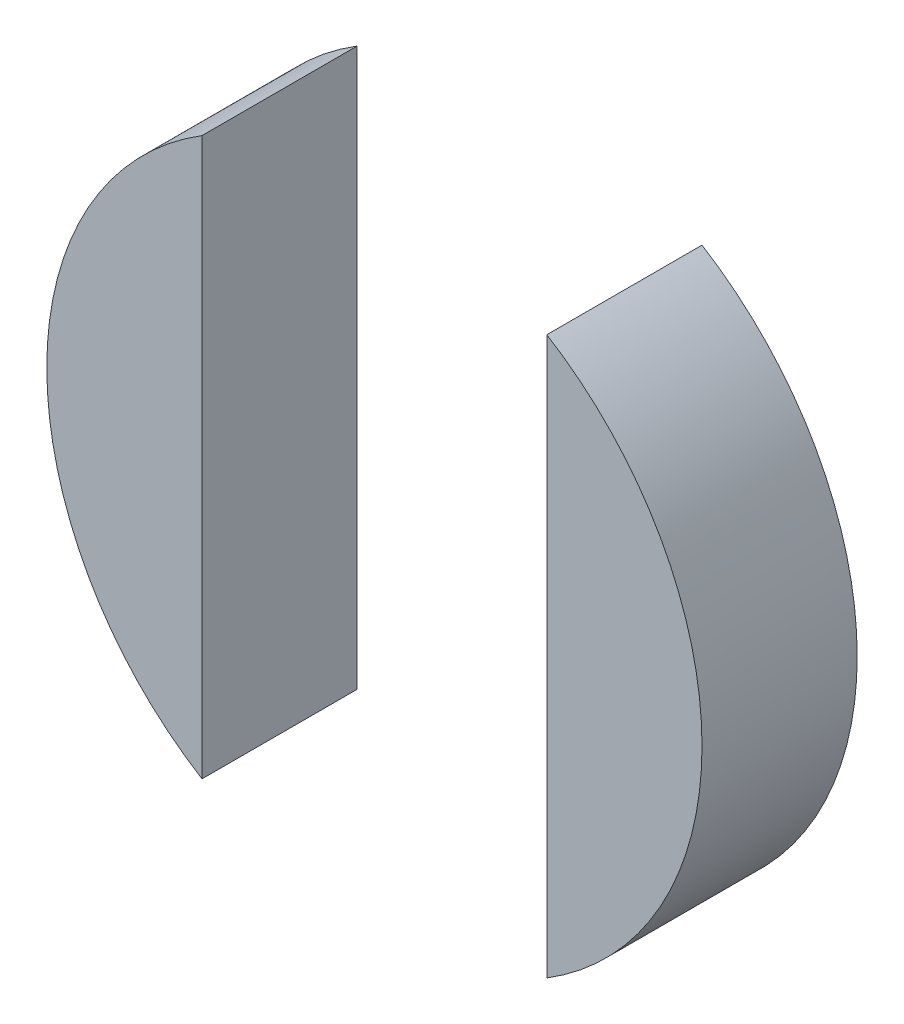
ISO-10303-21;
HEADER;
FILE_DESCRIPTION(('STEP AP214'),'2;1');
FILE_NAME('part.step','',(''),(''),'','','');
FILE_SCHEMA(('AUTOMOTIVE_DESIGN { 1 0 10303 214 1 1 1 1 }'));
ENDSEC;
DATA;
#1=APPLICATION_CONTEXT('core data for automotive mechanical design processes');
#2=APPLICATION_PROTOCOL_DEFINITION('international standard','automotive_design',2000,#1);
#3=PRODUCT_CONTEXT('',#1,'mechanical');
#4=PRODUCT('Part','Part','',(#3));
#5=PRODUCT_RELATED_PRODUCT_CATEGORY('part','',(#4));
#6=PRODUCT_DEFINITION_FORMATION('','',#4);
#7=PRODUCT_DEFINITION_CONTEXT('part definition',#1,'design');
#8=PRODUCT_DEFINITION('design','',#6,#7);
#9=PRODUCT_DEFINITION_SHAPE('','',#8);
#10=(LENGTH_UNIT() NAMED_UNIT(*) SI_UNIT(.MILLI.,.METRE.));
#11=(NAMED_UNIT(*) PLANE_ANGLE_UNIT() SI_UNIT($,.RADIAN.));
#12=(NAMED_UNIT(*) SI_UNIT($,.STERADIAN.) SOLID_ANGLE_UNIT());
#13=UNCERTAINTY_MEASURE_WITH_UNIT(LENGTH_MEASURE(1.E-05),#10,'distance_accuracy_value','');
#14=(GEOMETRIC_REPRESENTATION_CONTEXT(3) GLOBAL_UNCERTAINTY_ASSIGNED_CONTEXT((#13)) GLOBAL_UNIT_ASSIGNED_CONTEXT((#10,
#11,#12)) REPRESENTATION_CONTEXT('',''));
#15=CARTESIAN_POINT('',(0.,0.,0.));
#16=DIRECTION('',(0.,0.,1.));
#17=DIRECTION('',(1.,0.,0.));
#18=AXIS2_PLACEMENT_3D('',#15,#16,#17);
#19=CARTESIAN_POINT('',(0.,0.,4.5));
#20=DIRECTION('',(0.,0.,-1.));
#21=DIRECTION('',(-1.,0.,0.));
#22=AXIS2_PLACEMENT_3D('',#19,#20,#21);
#23=CYLINDRICAL_SURFACE('',#22,9.5);
#24=CARTESIAN_POINT('',(0.,0.,0.));
#25=DIRECTION('',(0.,0.,1.));
#26=DIRECTION('',(-1.,0.,0.));
#27=AXIS2_PLACEMENT_3D('',#24,#25,#26);
#28=CIRCLE('',#27,9.5);
#29=CARTESIAN_POINT('',(5.,-8.07774721070176,0.));
#30=VERTEX_POINT('',#29);
#31=CARTESIAN_POINT('',(5.,8.07774721070176,0.));
#32=VERTEX_POINT('',#31);
#33=EDGE_CURVE('E74',#30,#32,#28,.T.);
#34=ORIENTED_EDGE('',*,*,#33,.T.);
#35=DIRECTION('',(0.,0.,-1.));
#36=VECTOR('',#35,1.);
#37=CARTESIAN_POINT('',(5.,8.07774721070176,4.5));
#38=LINE('',#37,#36);
#39=CARTESIAN_POINT('',(5.,8.07774721070176,4.5));
#40=VERTEX_POINT('',#39);
#41=EDGE_CURVE('E12',#40,#32,#38,.T.);
#42=ORIENTED_EDGE('',*,*,#41,.F.);
#43=CARTESIAN_POINT('',(0.,0.,4.5));
#44=DIRECTION('',(0.,0.,1.));
#45=DIRECTION('',(-1.,0.,0.));
#46=AXIS2_PLACEMENT_3D('',#43,#44,#45);
#47=CIRCLE('',#46,9.5);
#48=CARTESIAN_POINT('',(5.,-8.07774721070176,4.5));
#49=VERTEX_POINT('',#48);
#50=EDGE_CURVE('E73',#49,#40,#47,.T.);
#51=ORIENTED_EDGE('',*,*,#50,.F.);
#52=DIRECTION('',(0.,0.,-1.));
#53=VECTOR('',#52,1.);
#54=CARTESIAN_POINT('',(5.,-8.07774721070176,4.5));
#55=LINE('',#54,#53);
#56=EDGE_CURVE('E51',#49,#30,#55,.T.);
#57=ORIENTED_EDGE('',*,*,#56,.T.);
#58=EDGE_LOOP('',(#34,#42,#51,#57));
#59=FACE_BOUND('',#58,.T.);
#60=ADVANCED_FACE('F43',(#59),#23,.T.);
#61=CARTESIAN_POINT('',(5.,8.07774721070176,4.5));
#62=DIRECTION('',(1.,0.,0.));
#63=DIRECTION('',(0.,0.,-1.));
#64=AXIS2_PLACEMENT_3D('',#61,#62,#63);
#65=PLANE('',#64);
#66=DIRECTION('',(0.,-1.,0.));
#67=VECTOR('',#66,1.);
#68=CARTESIAN_POINT('',(5.,8.07774721070176,0.));
#69=LINE('',#68,#67);
#70=EDGE_CURVE('E66',#32,#30,#69,.T.);
#71=ORIENTED_EDGE('',*,*,#70,.T.);
#72=ORIENTED_EDGE('',*,*,#56,.F.);
#73=DIRECTION('',(0.,-1.,0.));
#74=VECTOR('',#73,1.);
#75=CARTESIAN_POINT('',(5.,8.07774721070176,4.5));
#76=LINE('',#75,#74);
#77=EDGE_CURVE('E58',#40,#49,#76,.T.);
#78=ORIENTED_EDGE('',*,*,#77,.F.);
#79=ORIENTED_EDGE('',*,*,#41,.T.);
#80=EDGE_LOOP('',(#71,#72,#78,#79));
#81=FACE_BOUND('',#80,.T.);
#82=ADVANCED_FACE('F69',(#81),#65,.F.);
#83=CARTESIAN_POINT('',(0.,0.,4.5));
#84=DIRECTION('',(0.,0.,-1.));
#85=DIRECTION('',(-1.,0.,0.));
#86=AXIS2_PLACEMENT_3D('',#83,#84,#85);
#87=PLANE('',#86);
#88=ORIENTED_EDGE('',*,*,#50,.T.);
#89=ORIENTED_EDGE('',*,*,#77,.T.);
#90=EDGE_LOOP('',(#88,#89));
#91=FACE_BOUND('',#90,.T.);
#92=ADVANCED_FACE('F81',(#91),#87,.F.);
#93=CARTESIAN_POINT('',(0.,0.,0.));
#94=DIRECTION('',(0.,0.,-1.));
#95=DIRECTION('',(-1.,0.,0.));
#96=AXIS2_PLACEMENT_3D('',#93,#94,#95);
#97=PLANE('',#96);
#98=ORIENTED_EDGE('',*,*,#33,.F.);
#99=ORIENTED_EDGE('',*,*,#70,.F.);
#100=EDGE_LOOP('',(#98,#99));
#101=FACE_BOUND('',#100,.T.);
#102=ADVANCED_FACE('F77',(#101),#97,.T.);
#103=CLOSED_SHELL('',(#60,#82,#92,#102));
#104=MANIFOLD_SOLID_BREP('B2',#103);
#105=CARTESIAN_POINT('',(0.,0.,4.5));
#106=DIRECTION('',(0.,0.,-1.));
#107=DIRECTION('',(-1.,0.,0.));
#108=AXIS2_PLACEMENT_3D('',#105,#106,#107);
#109=CYLINDRICAL_SURFACE('',#108,9.5);
#110=CARTESIAN_POINT('',(0.,0.,0.));
#111=DIRECTION('',(0.,0.,1.));
#112=DIRECTION('',(1.,0.,0.));
#113=AXIS2_PLACEMENT_3D('',#110,#111,#112);
#114=CIRCLE('',#113,9.5);
#115=CARTESIAN_POINT('',(-5.,8.07774721070176,0.));
#116=VERTEX_POINT('',#115);
#117=CARTESIAN_POINT('',(-5.,-8.07774721070176,0.));
#118=VERTEX_POINT('',#117);
#119=EDGE_CURVE('E146',#116,#118,#114,.T.);
#120=ORIENTED_EDGE('',*,*,#119,.T.);
#121=DIRECTION('',(0.,0.,-1.));
#122=VECTOR('',#121,1.);
#123=CARTESIAN_POINT('',(-5.,-8.07774721070176,4.5));
#124=LINE('',#123,#122);
#125=CARTESIAN_POINT('',(-5.,-8.07774721070176,4.5));
#126=VERTEX_POINT('',#125);
#127=EDGE_CURVE('E41',#126,#118,#124,.T.);
#128=ORIENTED_EDGE('',*,*,#127,.F.);
#129=CARTESIAN_POINT('',(0.,0.,4.5));
#130=DIRECTION('',(0.,0.,1.));
#131=DIRECTION('',(1.,0.,0.));
#132=AXIS2_PLACEMENT_3D('',#129,#130,#131);
#133=CIRCLE('',#132,9.5);
#134=CARTESIAN_POINT('',(-5.,8.07774721070176,4.5));
#135=VERTEX_POINT('',#134);
#136=EDGE_CURVE('E145',#135,#126,#133,.T.);
#137=ORIENTED_EDGE('',*,*,#136,.F.);
#138=DIRECTION('',(0.,0.,-1.));
#139=VECTOR('',#138,1.);
#140=CARTESIAN_POINT('',(-5.,8.07774721070176,4.5));
#141=LINE('',#140,#139);
#142=EDGE_CURVE('E123',#135,#116,#141,.T.);
#143=ORIENTED_EDGE('',*,*,#142,.T.);
#144=EDGE_LOOP('',(#120,#128,#137,#143));
#145=FACE_BOUND('',#144,.T.);
#146=ADVANCED_FACE('F115',(#145),#109,.T.);
#147=CARTESIAN_POINT('',(-5.,8.07774721070176,4.5));
#148=DIRECTION('',(-1.,0.,0.));
#149=DIRECTION('',(0.,0.,1.));
#150=AXIS2_PLACEMENT_3D('',#147,#148,#149);
#151=PLANE('',#150);
#152=DIRECTION('',(0.,1.,0.));
#153=VECTOR('',#152,1.);
#154=CARTESIAN_POINT('',(-5.,8.07774721070176,0.));
#155=LINE('',#154,#153);
#156=EDGE_CURVE('E138',#118,#116,#155,.T.);
#157=ORIENTED_EDGE('',*,*,#156,.T.);
#158=ORIENTED_EDGE('',*,*,#142,.F.);
#159=DIRECTION('',(0.,1.,0.));
#160=VECTOR('',#159,1.);
#161=CARTESIAN_POINT('',(-5.,8.07774721070176,4.5));
#162=LINE('',#161,#160);
#163=EDGE_CURVE('E130',#126,#135,#162,.T.);
#164=ORIENTED_EDGE('',*,*,#163,.F.);
#165=ORIENTED_EDGE('',*,*,#127,.T.);
#166=EDGE_LOOP('',(#157,#158,#164,#165));
#167=FACE_BOUND('',#166,.T.);
#168=ADVANCED_FACE('F141',(#167),#151,.F.);
#169=CARTESIAN_POINT('',(0.,0.,4.5));
#170=DIRECTION('',(0.,0.,1.));
#171=DIRECTION('',(1.,0.,0.));
#172=AXIS2_PLACEMENT_3D('',#169,#170,#171);
#173=PLANE('',#172);
#174=ORIENTED_EDGE('',*,*,#136,.T.);
#175=ORIENTED_EDGE('',*,*,#163,.T.);
#176=EDGE_LOOP('',(#174,#175));
#177=FACE_BOUND('',#176,.T.);
#178=ADVANCED_FACE('F153',(#177),#173,.T.);
#179=CARTESIAN_POINT('',(0.,0.,0.));
#180=DIRECTION('',(0.,0.,1.));
#181=DIRECTION('',(1.,0.,0.));
#182=AXIS2_PLACEMENT_3D('',#179,#180,#181);
#183=PLANE('',#182);
#184=ORIENTED_EDGE('',*,*,#119,.F.);
#185=ORIENTED_EDGE('',*,*,#156,.F.);
#186=EDGE_LOOP('',(#184,#185));
#187=FACE_BOUND('',#186,.T.);
#188=ADVANCED_FACE('F149',(#187),#183,.F.);
#189=CLOSED_SHELL('',(#146,#168,#178,#188));
#190=MANIFOLD_SOLID_BREP('B6',#189);
#191=ADVANCED_BREP_SHAPE_REPRESENTATION('',(#18,#104,#190),#14);
#192=SHAPE_DEFINITION_REPRESENTATION(#9,#191);
ENDSEC;
END-ISO-10303-21;
